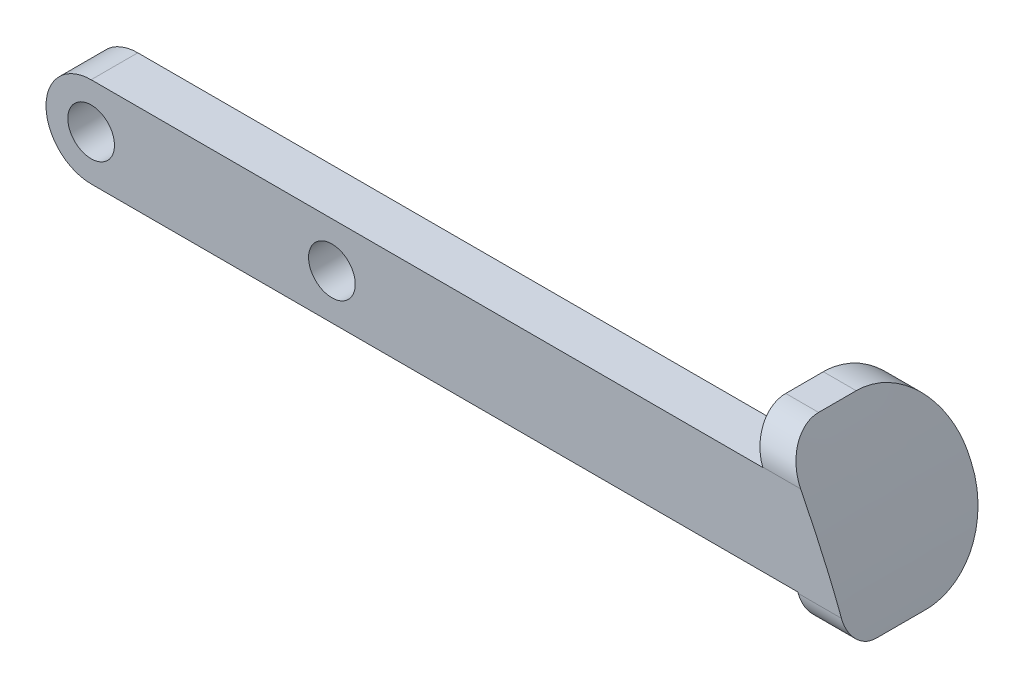
ISO-10303-21;
HEADER;
FILE_DESCRIPTION(('STEP AP214'),'2;1');
FILE_NAME('part.step','',(''),(''),'','','');
FILE_SCHEMA(('AUTOMOTIVE_DESIGN { 1 0 10303 214 1 1 1 1 }'));
ENDSEC;
DATA;
#1=APPLICATION_CONTEXT('core data for automotive mechanical design processes');
#2=APPLICATION_PROTOCOL_DEFINITION('international standard','automotive_design',2000,#1);
#3=PRODUCT_CONTEXT('',#1,'mechanical');
#4=PRODUCT('Part','Part','',(#3));
#5=PRODUCT_RELATED_PRODUCT_CATEGORY('part','',(#4));
#6=PRODUCT_DEFINITION_FORMATION('','',#4);
#7=PRODUCT_DEFINITION_CONTEXT('part definition',#1,'design');
#8=PRODUCT_DEFINITION('design','',#6,#7);
#9=PRODUCT_DEFINITION_SHAPE('','',#8);
#10=(LENGTH_UNIT() NAMED_UNIT(*) SI_UNIT(.MILLI.,.METRE.));
#11=(NAMED_UNIT(*) PLANE_ANGLE_UNIT() SI_UNIT($,.RADIAN.));
#12=(NAMED_UNIT(*) SI_UNIT($,.STERADIAN.) SOLID_ANGLE_UNIT());
#13=UNCERTAINTY_MEASURE_WITH_UNIT(LENGTH_MEASURE(1.E-05),#10,'distance_accuracy_value','');
#14=(GEOMETRIC_REPRESENTATION_CONTEXT(3) GLOBAL_UNCERTAINTY_ASSIGNED_CONTEXT((#13)) GLOBAL_UNIT_ASSIGNED_CONTEXT((#10,
#11,#12)) REPRESENTATION_CONTEXT('',''));
#15=CARTESIAN_POINT('',(0.,0.,0.));
#16=DIRECTION('',(0.,0.,1.));
#17=DIRECTION('',(1.,0.,0.));
#18=AXIS2_PLACEMENT_3D('',#15,#16,#17);
#19=CARTESIAN_POINT('',(0.,3.,-3.1));
#20=DIRECTION('',(0.,1.,0.));
#21=DIRECTION('',(0.,0.,-1.));
#22=AXIS2_PLACEMENT_3D('',#19,#20,#21);
#23=PLANE('',#22);
#24=DIRECTION('',(0.,0.,-1.));
#25=VECTOR('',#24,1.);
#26=CARTESIAN_POINT('',(44.6395584776889,3.,-3.1));
#27=LINE('',#26,#25);
#28=CARTESIAN_POINT('',(44.6395584776889,3.,0.));
#29=VERTEX_POINT('',#28);
#30=CARTESIAN_POINT('',(44.6395584776889,3.,-3.1));
#31=VERTEX_POINT('',#30);
#32=EDGE_CURVE('E153',#29,#31,#27,.T.);
#33=ORIENTED_EDGE('',*,*,#32,.T.);
#34=DIRECTION('',(1.,0.,0.));
#35=VECTOR('',#34,1.);
#36=CARTESIAN_POINT('',(0.,3.,-3.1));
#37=LINE('',#36,#35);
#38=CARTESIAN_POINT('',(0.,3.,-3.1));
#39=VERTEX_POINT('',#38);
#40=EDGE_CURVE('E252',#39,#31,#37,.T.);
#41=ORIENTED_EDGE('',*,*,#40,.F.);
#42=DIRECTION('',(0.,0.,1.));
#43=VECTOR('',#42,1.);
#44=CARTESIAN_POINT('',(0.,3.,-3.1));
#45=LINE('',#44,#43);
#46=CARTESIAN_POINT('',(0.,3.,0.));
#47=VERTEX_POINT('',#46);
#48=EDGE_CURVE('E172',#39,#47,#45,.T.);
#49=ORIENTED_EDGE('',*,*,#48,.T.);
#50=DIRECTION('',(1.,0.,0.));
#51=VECTOR('',#50,1.);
#52=CARTESIAN_POINT('',(0.,3.,0.));
#53=LINE('',#52,#51);
#54=EDGE_CURVE('E166',#47,#29,#53,.T.);
#55=ORIENTED_EDGE('',*,*,#54,.T.);
#56=EDGE_LOOP('',(#33,#41,#49,#55));
#57=FACE_BOUND('',#56,.T.);
#58=ADVANCED_FACE('F41',(#57),#23,.T.);
#59=CARTESIAN_POINT('',(0.,0.,-3.1));
#60=DIRECTION('',(0.,0.,1.));
#61=DIRECTION('',(-1.,0.,0.));
#62=AXIS2_PLACEMENT_3D('',#59,#60,#61);
#63=CYLINDRICAL_SURFACE('',#62,3.);
#64=CARTESIAN_POINT('',(0.,0.,0.));
#65=DIRECTION('',(0.,0.,1.));
#66=DIRECTION('',(1.,0.,0.));
#67=AXIS2_PLACEMENT_3D('',#64,#65,#66);
#68=CIRCLE('',#67,3.);
#69=CARTESIAN_POINT('',(0.,-3.,0.));
#70=VERTEX_POINT('',#69);
#71=EDGE_CURVE('E160',#47,#70,#68,.T.);
#72=ORIENTED_EDGE('',*,*,#71,.F.);
#73=ORIENTED_EDGE('',*,*,#48,.F.);
#74=CARTESIAN_POINT('',(0.,0.,-3.1));
#75=DIRECTION('',(0.,0.,1.));
#76=DIRECTION('',(1.,0.,0.));
#77=AXIS2_PLACEMENT_3D('',#74,#75,#76);
#78=CIRCLE('',#77,3.);
#79=CARTESIAN_POINT('',(0.,-3.,-3.1));
#80=VERTEX_POINT('',#79);
#81=EDGE_CURVE('E255',#39,#80,#78,.T.);
#82=ORIENTED_EDGE('',*,*,#81,.T.);
#83=DIRECTION('',(0.,0.,1.));
#84=VECTOR('',#83,1.);
#85=CARTESIAN_POINT('',(0.,-3.,-3.1));
#86=LINE('',#85,#84);
#87=EDGE_CURVE('E170',#80,#70,#86,.T.);
#88=ORIENTED_EDGE('',*,*,#87,.T.);
#89=EDGE_LOOP('',(#72,#73,#82,#88));
#90=FACE_BOUND('',#89,.T.);
#91=ADVANCED_FACE('F273',(#90),#63,.T.);
#92=CARTESIAN_POINT('',(0.,-3.,-3.1));
#93=DIRECTION('',(0.,1.,0.));
#94=DIRECTION('',(0.,0.,-1.));
#95=AXIS2_PLACEMENT_3D('',#92,#93,#94);
#96=PLANE('',#95);
#97=DIRECTION('',(1.,0.,0.));
#98=VECTOR('',#97,1.);
#99=CARTESIAN_POINT('',(0.,-3.,0.));
#100=LINE('',#99,#98);
#101=CARTESIAN_POINT('',(46.9652062875649,-3.,0.));
#102=VERTEX_POINT('',#101);
#103=EDGE_CURVE('E150',#70,#102,#100,.T.);
#104=ORIENTED_EDGE('',*,*,#103,.F.);
#105=ORIENTED_EDGE('',*,*,#87,.F.);
#106=DIRECTION('',(1.,0.,0.));
#107=VECTOR('',#106,1.);
#108=CARTESIAN_POINT('',(0.,-3.,-3.1));
#109=LINE('',#108,#107);
#110=CARTESIAN_POINT('',(46.9652062875649,-3.,-3.1));
#111=VERTEX_POINT('',#110);
#112=EDGE_CURVE('E152',#80,#111,#109,.T.);
#113=ORIENTED_EDGE('',*,*,#112,.T.);
#114=DIRECTION('',(0.,0.,-1.));
#115=VECTOR('',#114,1.);
#116=CARTESIAN_POINT('',(46.9652062875649,-3.,-3.1));
#117=LINE('',#116,#115);
#118=EDGE_CURVE('E136',#102,#111,#117,.T.);
#119=ORIENTED_EDGE('',*,*,#118,.F.);
#120=EDGE_LOOP('',(#104,#105,#113,#119));
#121=FACE_BOUND('',#120,.T.);
#122=ADVANCED_FACE('F148',(#121),#96,.F.);
#123=CARTESIAN_POINT('',(0.,0.,-3.1));
#124=DIRECTION('',(0.,0.,1.));
#125=DIRECTION('',(-1.,0.,0.));
#126=AXIS2_PLACEMENT_3D('',#123,#124,#125);
#127=CYLINDRICAL_SURFACE('',#126,1.55);
#128=CARTESIAN_POINT('',(0.,0.,-3.1));
#129=DIRECTION('',(0.,0.,1.));
#130=DIRECTION('',(1.,0.,0.));
#131=AXIS2_PLACEMENT_3D('',#128,#129,#130);
#132=CIRCLE('',#131,1.55);
#133=CARTESIAN_POINT('',(-1.55,0.,-3.1));
#134=VERTEX_POINT('',#133);
#135=EDGE_CURVE('E164',#134,#134,#132,.T.);
#136=CARTESIAN_POINT('',(0.,0.,0.));
#137=DIRECTION('',(0.,0.,1.));
#138=DIRECTION('',(1.,0.,0.));
#139=AXIS2_PLACEMENT_3D('',#136,#137,#138);
#140=CIRCLE('',#139,1.55);
#141=CARTESIAN_POINT('',(-1.55,0.,0.));
#142=VERTEX_POINT('',#141);
#143=EDGE_CURVE('E261',#142,#142,#140,.T.);
#144=CARTESIAN_POINT('',(-1.55,0.,-3.1));
#145=CARTESIAN_POINT('',(-1.55,0.,-3.06770833333333));
#146=CARTESIAN_POINT('',(-1.55,0.,-3.03541666666667));
#147=CARTESIAN_POINT('',(-1.55,0.,-2.97083333333333));
#148=CARTESIAN_POINT('',(-1.55,0.,-2.93854166666667));
#149=CARTESIAN_POINT('',(-1.55,0.,-2.87395833333333));
#150=CARTESIAN_POINT('',(-1.55,0.,-2.84166666666667));
#151=CARTESIAN_POINT('',(-1.55,0.,-2.77708333333333));
#152=CARTESIAN_POINT('',(-1.55,0.,-2.74479166666667));
#153=CARTESIAN_POINT('',(-1.55,0.,-2.68020833333333));
#154=CARTESIAN_POINT('',(-1.55,0.,-2.64791666666667));
#155=CARTESIAN_POINT('',(-1.55,0.,-2.58333333333333));
#156=CARTESIAN_POINT('',(-1.55,0.,-2.55104166666667));
#157=CARTESIAN_POINT('',(-1.55,0.,-2.48645833333333));
#158=CARTESIAN_POINT('',(-1.55,0.,-2.45416666666667));
#159=CARTESIAN_POINT('',(-1.55,0.,-2.38958333333333));
#160=CARTESIAN_POINT('',(-1.55,0.,-2.35729166666667));
#161=CARTESIAN_POINT('',(-1.55,0.,-2.29270833333333));
#162=CARTESIAN_POINT('',(-1.55,0.,-2.26041666666667));
#163=CARTESIAN_POINT('',(-1.55,0.,-2.19583333333333));
#164=CARTESIAN_POINT('',(-1.55,0.,-2.16354166666667));
#165=CARTESIAN_POINT('',(-1.55,0.,-2.09895833333333));
#166=CARTESIAN_POINT('',(-1.55,0.,-2.06666666666667));
#167=CARTESIAN_POINT('',(-1.55,0.,-2.00208333333333));
#168=CARTESIAN_POINT('',(-1.55,0.,-1.96979166666667));
#169=CARTESIAN_POINT('',(-1.55,0.,-1.90520833333333));
#170=CARTESIAN_POINT('',(-1.55,0.,-1.87291666666667));
#171=CARTESIAN_POINT('',(-1.55,0.,-1.80833333333333));
#172=CARTESIAN_POINT('',(-1.55,0.,-1.77604166666667));
#173=CARTESIAN_POINT('',(-1.55,0.,-1.71145833333333));
#174=CARTESIAN_POINT('',(-1.55,0.,-1.67916666666667));
#175=CARTESIAN_POINT('',(-1.55,0.,-1.61458333333333));
#176=CARTESIAN_POINT('',(-1.55,0.,-1.58229166666667));
#177=CARTESIAN_POINT('',(-1.55,0.,-1.51770833333333));
#178=CARTESIAN_POINT('',(-1.55,0.,-1.48541666666667));
#179=CARTESIAN_POINT('',(-1.55,0.,-1.42083333333333));
#180=CARTESIAN_POINT('',(-1.55,0.,-1.38854166666667));
#181=CARTESIAN_POINT('',(-1.55,0.,-1.32395833333333));
#182=CARTESIAN_POINT('',(-1.55,0.,-1.29166666666667));
#183=CARTESIAN_POINT('',(-1.55,0.,-1.22708333333333));
#184=CARTESIAN_POINT('',(-1.55,0.,-1.19479166666667));
#185=CARTESIAN_POINT('',(-1.55,0.,-1.13020833333333));
#186=CARTESIAN_POINT('',(-1.55,0.,-1.09791666666667));
#187=CARTESIAN_POINT('',(-1.55,0.,-1.03333333333333));
#188=CARTESIAN_POINT('',(-1.55,0.,-1.00104166666667));
#189=CARTESIAN_POINT('',(-1.55,0.,-0.936458333333334));
#190=CARTESIAN_POINT('',(-1.55,0.,-0.904166666666667));
#191=CARTESIAN_POINT('',(-1.55,0.,-0.839583333333334));
#192=CARTESIAN_POINT('',(-1.55,0.,-0.807291666666667));
#193=CARTESIAN_POINT('',(-1.55,0.,-0.742708333333334));
#194=CARTESIAN_POINT('',(-1.55,0.,-0.710416666666667));
#195=CARTESIAN_POINT('',(-1.55,0.,-0.645833333333334));
#196=CARTESIAN_POINT('',(-1.55,0.,-0.613541666666667));
#197=CARTESIAN_POINT('',(-1.55,0.,-0.548958333333333));
#198=CARTESIAN_POINT('',(-1.55,0.,-0.516666666666667));
#199=CARTESIAN_POINT('',(-1.55,0.,-0.452083333333333));
#200=CARTESIAN_POINT('',(-1.55,0.,-0.419791666666667));
#201=CARTESIAN_POINT('',(-1.55,0.,-0.355208333333334));
#202=CARTESIAN_POINT('',(-1.55,0.,-0.322916666666667));
#203=CARTESIAN_POINT('',(-1.55,0.,-0.258333333333333));
#204=CARTESIAN_POINT('',(-1.55,0.,-0.226041666666667));
#205=CARTESIAN_POINT('',(-1.55,0.,-0.161458333333333));
#206=CARTESIAN_POINT('',(-1.55,0.,-0.129166666666667));
#207=CARTESIAN_POINT('',(-1.55,0.,-0.0645833333333335));
#208=CARTESIAN_POINT('',(-1.55,0.,-0.0322916666666667));
#209=CARTESIAN_POINT('',(-1.55,0.,0.));
#210=B_SPLINE_CURVE_WITH_KNOTS('',3,(#144,#145,#146,#147,#148,#149,#150,#151,#152,#153,#154,
#155,#156,#157,#158,#159,#160,#161,#162,#163,#164,#165,#166,#167,#168,#169,#170,#171,#172,#173,
#174,#175,#176,#177,#178,#179,#180,#181,#182,#183,#184,#185,#186,#187,#188,#189,#190,#191,#192,
#193,#194,#195,#196,#197,#198,#199,#200,#201,#202,#203,#204,#205,#206,#207,#208,#209),
.UNSPECIFIED.,.F.,.F.,(4,2,2,2,2,2,2,2,2,2,2,2,2,2,2,2,2,2,2,2,2,2,2,2,2,2,2,2,2,2,2,2,4),(0.,
0.0968750000000002,0.19375,0.290625,0.3875,0.484375,0.58125,0.678125,0.775,0.871875,0.96875,
1.065625,1.1625,1.259375,1.35625,1.453125,1.55,1.646875,1.74375,1.840625,1.9375,2.034375,
2.13125,2.228125,2.325,2.421875,2.51875,2.615625,2.7125,2.809375,2.90625,3.003125,3.1),.UNSPECIFIED.);
#211=EDGE_CURVE('BSEAM280',#134,#142,#210,.T.);
#212=ORIENTED_EDGE('',*,*,#135,.F.);
#213=ORIENTED_EDGE('',*,*,#143,.T.);
#214=ORIENTED_EDGE('',*,*,#211,.T.);
#215=ORIENTED_EDGE('',*,*,#211,.F.);
#216=EDGE_LOOP('',(#212,#214,#213,#215));
#217=FACE_BOUND('',#216,.T.);
#218=ADVANCED_FACE('F280',(#217),#127,.F.);
#219=CARTESIAN_POINT('',(16.,0.,-3.1));
#220=DIRECTION('',(0.,0.,1.));
#221=DIRECTION('',(-1.,0.,0.));
#222=AXIS2_PLACEMENT_3D('',#219,#220,#221);
#223=CYLINDRICAL_SURFACE('',#222,1.55);
#224=CARTESIAN_POINT('',(16.,0.,-3.1));
#225=DIRECTION('',(0.,0.,1.));
#226=DIRECTION('',(1.,0.,0.));
#227=AXIS2_PLACEMENT_3D('',#224,#225,#226);
#228=CIRCLE('',#227,1.55);
#229=CARTESIAN_POINT('',(14.45,0.,-3.1));
#230=VERTEX_POINT('',#229);
#231=EDGE_CURVE('E161',#230,#230,#228,.T.);
#232=CARTESIAN_POINT('',(16.,0.,0.));
#233=DIRECTION('',(0.,0.,1.));
#234=DIRECTION('',(1.,0.,0.));
#235=AXIS2_PLACEMENT_3D('',#232,#233,#234);
#236=CIRCLE('',#235,1.55);
#237=CARTESIAN_POINT('',(14.45,0.,0.));
#238=VERTEX_POINT('',#237);
#239=EDGE_CURVE('E248',#238,#238,#236,.T.);
#240=CARTESIAN_POINT('',(14.45,0.,-3.1));
#241=CARTESIAN_POINT('',(14.45,0.,-3.06770833333333));
#242=CARTESIAN_POINT('',(14.45,0.,-3.03541666666667));
#243=CARTESIAN_POINT('',(14.45,0.,-2.97083333333333));
#244=CARTESIAN_POINT('',(14.45,0.,-2.93854166666667));
#245=CARTESIAN_POINT('',(14.45,0.,-2.87395833333333));
#246=CARTESIAN_POINT('',(14.45,0.,-2.84166666666667));
#247=CARTESIAN_POINT('',(14.45,0.,-2.77708333333333));
#248=CARTESIAN_POINT('',(14.45,0.,-2.74479166666667));
#249=CARTESIAN_POINT('',(14.45,0.,-2.68020833333333));
#250=CARTESIAN_POINT('',(14.45,0.,-2.64791666666667));
#251=CARTESIAN_POINT('',(14.45,0.,-2.58333333333333));
#252=CARTESIAN_POINT('',(14.45,0.,-2.55104166666667));
#253=CARTESIAN_POINT('',(14.45,0.,-2.48645833333333));
#254=CARTESIAN_POINT('',(14.45,0.,-2.45416666666667));
#255=CARTESIAN_POINT('',(14.45,0.,-2.38958333333333));
#256=CARTESIAN_POINT('',(14.45,0.,-2.35729166666667));
#257=CARTESIAN_POINT('',(14.45,0.,-2.29270833333333));
#258=CARTESIAN_POINT('',(14.45,0.,-2.26041666666667));
#259=CARTESIAN_POINT('',(14.45,0.,-2.19583333333333));
#260=CARTESIAN_POINT('',(14.45,0.,-2.16354166666667));
#261=CARTESIAN_POINT('',(14.45,0.,-2.09895833333333));
#262=CARTESIAN_POINT('',(14.45,0.,-2.06666666666667));
#263=CARTESIAN_POINT('',(14.45,0.,-2.00208333333333));
#264=CARTESIAN_POINT('',(14.45,0.,-1.96979166666667));
#265=CARTESIAN_POINT('',(14.45,0.,-1.90520833333333));
#266=CARTESIAN_POINT('',(14.45,0.,-1.87291666666667));
#267=CARTESIAN_POINT('',(14.45,0.,-1.80833333333333));
#268=CARTESIAN_POINT('',(14.45,0.,-1.77604166666667));
#269=CARTESIAN_POINT('',(14.45,0.,-1.71145833333333));
#270=CARTESIAN_POINT('',(14.45,0.,-1.67916666666667));
#271=CARTESIAN_POINT('',(14.45,0.,-1.61458333333333));
#272=CARTESIAN_POINT('',(14.45,0.,-1.58229166666667));
#273=CARTESIAN_POINT('',(14.45,0.,-1.51770833333333));
#274=CARTESIAN_POINT('',(14.45,0.,-1.48541666666667));
#275=CARTESIAN_POINT('',(14.45,0.,-1.42083333333333));
#276=CARTESIAN_POINT('',(14.45,0.,-1.38854166666667));
#277=CARTESIAN_POINT('',(14.45,0.,-1.32395833333333));
#278=CARTESIAN_POINT('',(14.45,0.,-1.29166666666667));
#279=CARTESIAN_POINT('',(14.45,0.,-1.22708333333333));
#280=CARTESIAN_POINT('',(14.45,0.,-1.19479166666667));
#281=CARTESIAN_POINT('',(14.45,0.,-1.13020833333333));
#282=CARTESIAN_POINT('',(14.45,0.,-1.09791666666667));
#283=CARTESIAN_POINT('',(14.45,0.,-1.03333333333333));
#284=CARTESIAN_POINT('',(14.45,0.,-1.00104166666667));
#285=CARTESIAN_POINT('',(14.45,0.,-0.936458333333334));
#286=CARTESIAN_POINT('',(14.45,0.,-0.904166666666667));
#287=CARTESIAN_POINT('',(14.45,0.,-0.839583333333334));
#288=CARTESIAN_POINT('',(14.45,0.,-0.807291666666667));
#289=CARTESIAN_POINT('',(14.45,0.,-0.742708333333334));
#290=CARTESIAN_POINT('',(14.45,0.,-0.710416666666667));
#291=CARTESIAN_POINT('',(14.45,0.,-0.645833333333334));
#292=CARTESIAN_POINT('',(14.45,0.,-0.613541666666667));
#293=CARTESIAN_POINT('',(14.45,0.,-0.548958333333333));
#294=CARTESIAN_POINT('',(14.45,0.,-0.516666666666667));
#295=CARTESIAN_POINT('',(14.45,0.,-0.452083333333333));
#296=CARTESIAN_POINT('',(14.45,0.,-0.419791666666667));
#297=CARTESIAN_POINT('',(14.45,0.,-0.355208333333334));
#298=CARTESIAN_POINT('',(14.45,0.,-0.322916666666667));
#299=CARTESIAN_POINT('',(14.45,0.,-0.258333333333333));
#300=CARTESIAN_POINT('',(14.45,0.,-0.226041666666667));
#301=CARTESIAN_POINT('',(14.45,0.,-0.161458333333333));
#302=CARTESIAN_POINT('',(14.45,0.,-0.129166666666667));
#303=CARTESIAN_POINT('',(14.45,0.,-0.0645833333333335));
#304=CARTESIAN_POINT('',(14.45,0.,-0.0322916666666667));
#305=CARTESIAN_POINT('',(14.45,0.,0.));
#306=B_SPLINE_CURVE_WITH_KNOTS('',3,(#240,#241,#242,#243,#244,#245,#246,#247,#248,#249,#250,
#251,#252,#253,#254,#255,#256,#257,#258,#259,#260,#261,#262,#263,#264,#265,#266,#267,#268,#269,
#270,#271,#272,#273,#274,#275,#276,#277,#278,#279,#280,#281,#282,#283,#284,#285,#286,#287,#288,
#289,#290,#291,#292,#293,#294,#295,#296,#297,#298,#299,#300,#301,#302,#303,#304,#305),
.UNSPECIFIED.,.F.,.F.,(4,2,2,2,2,2,2,2,2,2,2,2,2,2,2,2,2,2,2,2,2,2,2,2,2,2,2,2,2,2,2,2,4),(0.,
0.0968750000000002,0.19375,0.290625,0.3875,0.484375,0.58125,0.678125,0.775,0.871875,0.96875,
1.065625,1.1625,1.259375,1.35625,1.453125,1.55,1.646875,1.74375,1.840625,1.9375,2.034375,
2.13125,2.228125,2.325,2.421875,2.51875,2.615625,2.7125,2.809375,2.90625,3.003125,3.1),.UNSPECIFIED.);
#307=EDGE_CURVE('BSEAM286',#230,#238,#306,.T.);
#308=ORIENTED_EDGE('',*,*,#231,.F.);
#309=ORIENTED_EDGE('',*,*,#239,.T.);
#310=ORIENTED_EDGE('',*,*,#307,.T.);
#311=ORIENTED_EDGE('',*,*,#307,.F.);
#312=EDGE_LOOP('',(#308,#310,#309,#311));
#313=FACE_BOUND('',#312,.T.);
#314=ADVANCED_FACE('F286',(#313),#223,.F.);
#315=CARTESIAN_POINT('',(0.,0.,-3.1));
#316=DIRECTION('',(0.,0.,-1.));
#317=DIRECTION('',(1.,0.,0.));
#318=AXIS2_PLACEMENT_3D('',#315,#316,#317);
#319=PLANE('',#318);
#320=DIRECTION('',(0.361408593812913,-0.932407544112645,0.));
#321=VECTOR('',#320,1.);
#322=CARTESIAN_POINT('',(39.819850541901,15.4344913670606,-3.1));
#323=LINE('',#322,#321);
#324=EDGE_CURVE('E154',#31,#111,#323,.T.);
#325=ORIENTED_EDGE('',*,*,#324,.T.);
#326=ORIENTED_EDGE('',*,*,#112,.F.);
#327=ORIENTED_EDGE('',*,*,#81,.F.);
#328=ORIENTED_EDGE('',*,*,#40,.T.);
#329=EDGE_LOOP('',(#325,#326,#327,#328));
#330=FACE_BOUND('',#329,.T.);
#331=ORIENTED_EDGE('',*,*,#231,.T.);
#332=EDGE_LOOP('',(#331));
#333=FACE_BOUND('',#332,.T.);
#334=ORIENTED_EDGE('',*,*,#135,.T.);
#335=EDGE_LOOP('',(#334));
#336=FACE_BOUND('',#335,.T.);
#337=ADVANCED_FACE('F213',(#330,#333,#336),#319,.T.);
#338=CARTESIAN_POINT('',(0.,0.,0.));
#339=DIRECTION('',(0.,0.,-1.));
#340=DIRECTION('',(1.,0.,0.));
#341=AXIS2_PLACEMENT_3D('',#338,#339,#340);
#342=PLANE('',#341);
#343=ORIENTED_EDGE('',*,*,#239,.F.);
#344=EDGE_LOOP('',(#343));
#345=FACE_BOUND('',#344,.T.);
#346=ORIENTED_EDGE('',*,*,#143,.F.);
#347=EDGE_LOOP('',(#346));
#348=FACE_BOUND('',#347,.T.);
#349=CARTESIAN_POINT('',(45.8446255617211,5.52517801406493,0.));
#350=CARTESIAN_POINT('',(47.6225170615618,2.2123782727855,0.));
#351=CARTESIAN_POINT('',(49.2890510500116,-1.18916518240475,0.));
#352=CARTESIAN_POINT('',(50.4632290338258,-4.76886794904122,0.));
#353=B_SPLINE_CURVE_WITH_KNOTS('',3,(#349,#350,#351,#352),.UNSPECIFIED.,.F.,.F.,(4,4),(0.,1.),.UNSPECIFIED.);
#354=CARTESIAN_POINT('',(47.1498799686748,3.02517801406503,0.));
#355=VERTEX_POINT('',#354);
#356=CARTESIAN_POINT('',(49.8652239145846,-3.06886794904115,0.));
#357=VERTEX_POINT('',#356);
#358=EDGE_CURVE('E229',#355,#357,#353,.T.);
#359=ORIENTED_EDGE('',*,*,#358,.F.);
#360=DIRECTION('',(1.,0.,0.));
#361=VECTOR('',#360,1.);
#362=CARTESIAN_POINT('',(45.8446255617211,3.02517801406493,0.));
#363=LINE('',#362,#361);
#364=CARTESIAN_POINT('',(44.629799278811,3.02517801406493,0.));
#365=VERTEX_POINT('',#364);
#366=EDGE_CURVE('E316',#365,#355,#363,.T.);
#367=ORIENTED_EDGE('',*,*,#366,.F.);
#368=DIRECTION('',(-0.361408593812913,0.932407544112644,0.));
#369=VECTOR('',#368,1.);
#370=CARTESIAN_POINT('',(43.6607793580293,5.52517801406493,0.));
#371=LINE('',#370,#369);
#372=EDGE_CURVE('E145',#29,#365,#371,.T.);
#373=ORIENTED_EDGE('',*,*,#372,.F.);
#374=ORIENTED_EDGE('',*,*,#54,.F.);
#375=ORIENTED_EDGE('',*,*,#71,.T.);
#376=ORIENTED_EDGE('',*,*,#103,.T.);
#377=CARTESIAN_POINT('',(46.9919000533746,-3.06886794904122,0.));
#378=VERTEX_POINT('',#377);
#379=EDGE_CURVE('E133',#378,#102,#371,.T.);
#380=ORIENTED_EDGE('',*,*,#379,.F.);
#381=DIRECTION('',(-1.,0.,0.));
#382=VECTOR('',#381,1.);
#383=CARTESIAN_POINT('',(47.6508335995062,-3.06886794904122,0.));
#384=LINE('',#383,#382);
#385=EDGE_CURVE('E339',#357,#378,#384,.T.);
#386=ORIENTED_EDGE('',*,*,#385,.F.);
#387=EDGE_LOOP('',(#359,#367,#373,#374,#375,#376,#380,#386));
#388=FACE_BOUND('',#387,.T.);
#389=ADVANCED_FACE('F158',(#345,#348,#388),#342,.F.);
#390=CARTESIAN_POINT('',(45.8446255617211,5.52517801406493,-10.));
#391=CARTESIAN_POINT('',(47.6225170615618,2.2123782727855,-10.));
#392=CARTESIAN_POINT('',(49.2890510500116,-1.18916518240475,-10.));
#393=CARTESIAN_POINT('',(50.4632290338258,-4.76886794904122,-10.));
#394=B_SPLINE_CURVE_WITH_KNOTS('',3,(#390,#391,#392,#393),.UNSPECIFIED.,.F.,.F.,(4,4),(0.,1.),.UNSPECIFIED.);
#395=DIRECTION('',(0.,0.,1.));
#396=VECTOR('',#395,1.);
#397=SURFACE_OF_LINEAR_EXTRUSION('',#394,#396);
#398=DIRECTION('',(0.,0.,1.));
#399=VECTOR('',#398,1.);
#400=CARTESIAN_POINT('',(50.4632290338258,-4.76886794904122,-10.));
#401=LINE('',#400,#399);
#402=CARTESIAN_POINT('',(50.4632290338258,-4.76886794904122,-5.));
#403=VERTEX_POINT('',#402);
#404=CARTESIAN_POINT('',(50.4632290338258,-4.76886794904122,-1.7));
#405=VERTEX_POINT('',#404);
#406=EDGE_CURVE('E228',#403,#405,#401,.T.);
#407=ORIENTED_EDGE('',*,*,#406,.F.);
#408=CARTESIAN_POINT('',(48.4930884409791,0.231132050958781,-10.));
#409=CARTESIAN_POINT('',(48.5596761804852,0.0844007288168149,-10.0000069779001));
#410=CARTESIAN_POINT('',(48.6256932600272,-0.0626064181320284,-9.99354081425444));
#411=CARTESIAN_POINT('',(48.7561396735039,-0.356225784137563,-9.96756702051866));
#412=CARTESIAN_POINT('',(48.820568498141,-0.502837863424689,-9.94805526214704));
#413=CARTESIAN_POINT('',(48.9475354432491,-0.795054942855532,-9.89581835870529));
#414=CARTESIAN_POINT('',(49.0100674533572,-0.940655719216084,-9.86305456496875));
#415=CARTESIAN_POINT('',(49.1325863612974,-1.22931638755786,-9.78429390715526));
#416=CARTESIAN_POINT('',(49.1925735152128,-1.37237653435072,-9.73829837820026));
#417=CARTESIAN_POINT('',(49.3097281259377,-1.6551832642757,-9.63299445044576));
#418=CARTESIAN_POINT('',(49.3668881205666,-1.79492062026427,-9.57365289754996));
#419=CARTESIAN_POINT('',(49.4778198533986,-2.06948666861618,-9.44188450609099));
#420=CARTESIAN_POINT('',(49.5315917504777,-2.20431559102236,-9.36945828171625));
#421=CARTESIAN_POINT('',(49.6353074075545,-2.46762165232322,-9.21191553567224));
#422=CARTESIAN_POINT('',(49.6852563844632,-2.59610735919521,-9.12681679237507));
#423=CARTESIAN_POINT('',(49.7810767542162,-2.84562712160713,-8.94429222287648));
#424=CARTESIAN_POINT('',(49.826948484538,-2.96666179362051,-8.8468674185349));
#425=CARTESIAN_POINT('',(49.9115017678737,-3.19242660988634,-8.64698288652698));
#426=CARTESIAN_POINT('',(49.9504565561542,-3.29770502253179,-8.54525750804966));
#427=CARTESIAN_POINT('',(50.0243581057138,-3.49956503500845,-8.33218124401082));
#428=CARTESIAN_POINT('',(50.0593051901517,-3.59614733591012,-8.22083113580502));
#429=CARTESIAN_POINT('',(50.1250446307716,-3.77964147065492,-7.98923541822149));
#430=CARTESIAN_POINT('',(50.155835960489,-3.86655091439185,-7.86898762244331));
#431=CARTESIAN_POINT('',(50.2131312801512,-4.02973141755922,-7.62052069010088));
#432=CARTESIAN_POINT('',(50.2396356151681,-4.10600333316536,-7.49230219627126));
#433=CARTESIAN_POINT('',(50.2865779439868,-4.24215847553799,-7.23807862685347));
#434=CARTESIAN_POINT('',(50.3073096661881,-4.30281264440841,-7.11253996606943));
#435=CARTESIAN_POINT('',(50.3449378085286,-4.41358908006881,-6.85635076659207));
#436=CARTESIAN_POINT('',(50.3618345229326,-4.46371215490066,-6.72570062101177));
#437=CARTESIAN_POINT('',(50.3917441291674,-4.55287836161986,-6.46041223772643));
#438=CARTESIAN_POINT('',(50.4047615261213,-4.59193434331516,-6.32577882726947));
#439=CARTESIAN_POINT('',(50.4269152904088,-4.65864043815421,-6.05345651786395));
#440=CARTESIAN_POINT('',(50.4360532321717,-4.68629517822037,-5.91576888235336));
#441=CARTESIAN_POINT('',(50.4499127692377,-4.728323814497,-5.64861254571213));
#442=CARTESIAN_POINT('',(50.4549107379208,-4.74352786562429,-5.51928804884119));
#443=CARTESIAN_POINT('',(50.4615662687789,-4.76379907331095,-5.25997724148349));
#444=CARTESIAN_POINT('',(50.4632293339671,-4.76888292937344,-5.12999237669643));
#445=CARTESIAN_POINT('',(50.4632290338258,-4.76886794904122,-5.));
#446=B_SPLINE_CURVE_WITH_KNOTS('',3,(#408,#409,#410,#411,#412,#413,#414,#415,#416,#417,#418,
#419,#420,#421,#422,#423,#424,#425,#426,#427,#428,#429,#430,#431,#432,#433,#434,#435,#436,#437,
#438,#439,#440,#441,#442,#443,#444,#445),.UNSPECIFIED.,.F.,.F.,(4,2,2,2,2,2,2,2,2,2,2,2,2,2,2,2,
2,2,4),(0.,0.48329299092671,0.96673899246441,1.45160521658183,1.93642253338684,2.42245780044711,
2.90847025916163,3.39380720111833,3.87910393381828,4.33298104852331,4.78682153935593,
5.24077392370179,5.69468974997018,6.11703168544179,6.5393412031331,6.96115835647857,
7.38280415646802,7.77330276440966,8.16315646815633),.UNSPECIFIED.);
#447=CARTESIAN_POINT('',(48.4930884409794,0.231132050959114,-10.));
#448=VERTEX_POINT('',#447);
#449=EDGE_CURVE('E194',#448,#403,#446,.T.);
#450=ORIENTED_EDGE('',*,*,#449,.F.);
#451=CARTESIAN_POINT('',(48.3587581904946,0.525178014065088,-10.));
#452=VERTEX_POINT('',#451);
#453=EDGE_CURVE('E144',#452,#448,#394,.T.);
#454=ORIENTED_EDGE('',*,*,#453,.F.);
#455=CARTESIAN_POINT('',(45.8446255617211,5.52517801406493,-5.));
#456=CARTESIAN_POINT('',(45.844612055669,5.52520032541012,-5.12894689257132));
#457=CARTESIAN_POINT('',(45.8473020135973,5.52019080682159,-5.25788474204632));
#458=CARTESIAN_POINT('',(45.8579889588883,5.50027365409044,-5.51473280770917));
#459=CARTESIAN_POINT('',(45.8659842744154,5.48536913807972,-5.64264333478168));
#460=CARTESIAN_POINT('',(45.8871396337001,5.44590665570231,-5.89600045705318));
#461=CARTESIAN_POINT('',(45.9002788301121,5.42138765470114,-6.02145487806531));
#462=CARTESIAN_POINT('',(45.9315377979842,5.36299985537038,-6.26953423333331));
#463=CARTESIAN_POINT('',(45.9496577714741,5.32913067777954,-6.3921590525964));
#464=CARTESIAN_POINT('',(45.9906216030089,5.25246849655112,-6.63363078077556));
#465=CARTESIAN_POINT('',(46.0134604433272,5.20968497142849,-6.75248154914413));
#466=CARTESIAN_POINT('',(46.0635873879391,5.1156399591089,-6.98582714292488));
#467=CARTESIAN_POINT('',(46.0908771618346,5.06437529042319,-7.10032031379271));
#468=CARTESIAN_POINT('',(46.1789787559354,4.89857350179391,-7.43632741453544));
#469=CARTESIAN_POINT('',(46.246033471092,4.77200879609154,-7.65043046965443));
#470=CARTESIAN_POINT('',(46.3975372056785,4.48456421811713,-8.06430140035973));
#471=CARTESIAN_POINT('',(46.482681503546,4.32229877430508,-8.26283982377646));
#472=CARTESIAN_POINT('',(46.6648146416682,3.97276468436136,-8.630215686075));
#473=CARTESIAN_POINT('',(46.7618073262775,3.78548792115139,-8.79904344136953));
#474=CARTESIAN_POINT('',(46.9760163522791,3.36830511332541,-9.12237458298746));
#475=CARTESIAN_POINT('',(47.0942778141278,3.13597317527722,-9.27305484517216));
#476=CARTESIAN_POINT('',(47.337506572345,2.65247231201106,-9.53322180226189));
#477=CARTESIAN_POINT('',(47.4624779514197,2.40129188045373,-9.64268308501774));
#478=CARTESIAN_POINT('',(47.7166820015217,1.88315234438987,-9.81991060189795));
#479=CARTESIAN_POINT('',(47.8459447250183,1.61606095702039,-9.88725051223936));
#480=CARTESIAN_POINT('',(48.0392534191688,1.21004541459007,-9.95477592650196));
#481=CARTESIAN_POINT('',(48.1035776897444,1.07384171555597,-9.97170361097202));
#482=CARTESIAN_POINT('',(48.2316741035906,0.800245289498363,-9.99431200598105));
#483=CARTESIAN_POINT('',(48.295446240788,0.662852549429205,-9.99999259296406));
#484=CARTESIAN_POINT('',(48.3587581904946,0.525178014065096,-10.));
#485=B_SPLINE_CURVE_WITH_KNOTS('',3,(#455,#456,#457,#458,#459,#460,#461,#462,#463,#464,#465,
#466,#467,#468,#469,#470,#471,#472,#473,#474,#475,#476,#477,#478,#479,#480,#481,#482,#483,#484),
.UNSPECIFIED.,.F.,.F.,(4,2,2,2,2,2,2,2,2,2,2,2,2,2,4),(0.,0.386701247288153,0.773280694289821,
1.15830934999344,1.5433536254987,1.9279905586154,2.31277210718464,3.08214097274196,
3.88949076485224,4.69710321079233,5.59672322437804,6.49689696331696,7.40604017413921,
7.86040752386931,8.31477986506312),.UNSPECIFIED.);
#486=CARTESIAN_POINT('',(45.8446255617211,5.52517801406493,-5.));
#487=VERTEX_POINT('',#486);
#488=EDGE_CURVE('E186',#487,#452,#485,.T.);
#489=ORIENTED_EDGE('',*,*,#488,.F.);
#490=DIRECTION('',(0.,0.,1.));
#491=VECTOR('',#490,1.);
#492=CARTESIAN_POINT('',(45.8446255617211,5.52517801406493,-10.));
#493=LINE('',#492,#491);
#494=CARTESIAN_POINT('',(45.8446255617211,5.52517801406493,-2.5));
#495=VERTEX_POINT('',#494);
#496=EDGE_CURVE('E237',#487,#495,#493,.T.);
#497=ORIENTED_EDGE('',*,*,#496,.T.);
#498=CARTESIAN_POINT('',(47.1498799686747,3.02517801406493,0.));
#499=CARTESIAN_POINT('',(47.0714822798714,3.18042498483698,2.74764117618217E-05));
#500=CARTESIAN_POINT('',(46.9925885682587,3.33547452504738,-0.0144630732755245));
#501=CARTESIAN_POINT('',(46.8359585984083,3.64135389254784,-0.0721217237579438));
#502=CARTESIAN_POINT('',(46.7582265972328,3.79216942968226,-0.115377032752658));
#503=CARTESIAN_POINT('',(46.6064693375411,4.08496414661408,-0.230282645962123));
#504=CARTESIAN_POINT('',(46.5324494607051,4.22693056581575,-0.301972905689635));
#505=CARTESIAN_POINT('',(46.391062423182,4.49685612196524,-0.472773429717924));
#506=CARTESIAN_POINT('',(46.3236878560492,4.62483087081766,-0.571852688500329));
#507=CARTESIAN_POINT('',(46.2023325112556,4.85450780075351,-0.789166274447955));
#508=CARTESIAN_POINT('',(46.1477883781618,4.95733030953245,-0.905881208157153));
#509=CARTESIAN_POINT('',(46.0745011360641,5.09514045902349,-1.09593020796981));
#510=CARTESIAN_POINT('',(46.0514854780529,5.13835497104457,-1.16180756792905));
#511=CARTESIAN_POINT('',(46.0086181907068,5.21875447845802,-1.29813830421373));
#512=CARTESIAN_POINT('',(45.9887659478706,5.25594064299076,-1.36859078951629));
#513=CARTESIAN_POINT('',(45.9547670875005,5.31956934014822,-1.50465703754549));
#514=CARTESIAN_POINT('',(45.940220317233,5.3467682397269,-1.56981890413932));
#515=CARTESIAN_POINT('',(45.9140351720694,5.39569804230047,-1.70272592528889));
#516=CARTESIAN_POINT('',(45.9023962947022,5.4174298899825,-1.77047063120626));
#517=CARTESIAN_POINT('',(45.8822237618985,5.45507891169791,-1.90784761764563));
#518=CARTESIAN_POINT('',(45.8736834922397,5.47100847146055,-1.97747553258287));
#519=CARTESIAN_POINT('',(45.859813656103,5.49687187230107,-2.1181160357354));
#520=CARTESIAN_POINT('',(45.8544819416248,5.50680972459732,-2.18912766465744));
#521=CARTESIAN_POINT('',(45.8487408032335,5.51750955022813,-2.30029130010409));
#522=CARTESIAN_POINT('',(45.8471972543524,5.52038594596278,-2.34019504560636));
#523=CARTESIAN_POINT('',(45.8451401385236,5.52421919309211,-2.42006380239128));
#524=CARTESIAN_POINT('',(45.8446251013843,5.52517878443622,-2.46002864438367));
#525=CARTESIAN_POINT('',(45.8446255617211,5.52517801406493,-2.5));
#526=B_SPLINE_CURVE_WITH_KNOTS('',3,(#498,#499,#500,#501,#502,#503,#504,#505,#506,#507,#508,
#509,#510,#511,#512,#513,#514,#515,#516,#517,#518,#519,#520,#521,#522,#523,#524,#525),
.UNSPECIFIED.,.F.,.F.,(4,2,2,2,2,2,2,2,2,2,2,2,2,4),(0.,0.521245705702186,1.0440789585235,
1.56764949065575,2.09062972877987,2.58200565737025,2.82790545956814,3.07375751464917,
3.28974327544293,3.50569168898992,3.72117639334369,3.93651667830635,4.05657479071794,
4.17646116456472),.UNSPECIFIED.);
#527=EDGE_CURVE('E322',#355,#495,#526,.T.);
#528=ORIENTED_EDGE('',*,*,#527,.F.);
#529=ORIENTED_EDGE('',*,*,#358,.T.);
#530=CARTESIAN_POINT('',(50.4632290338258,-4.76886794904122,-1.7));
#531=CARTESIAN_POINT('',(50.4632288275113,-4.76886881291591,-1.65396280781216));
#532=CARTESIAN_POINT('',(50.462615261702,-4.7669965906476,-1.60794822850901));
#533=CARTESIAN_POINT('',(50.4601669211131,-4.75953542129718,-1.51626036786668));
#534=CARTESIAN_POINT('',(50.4583323128456,-4.7539469809919,-1.47058704084994));
#535=CARTESIAN_POINT('',(50.4510190873418,-4.73169378399643,-1.3347668805819));
#536=CARTESIAN_POINT('',(50.4437309849388,-4.70954075615502,-1.24554980687492));
#537=CARTESIAN_POINT('',(50.4245116341149,-4.65139622128836,-1.07233430125503));
#538=CARTESIAN_POINT('',(50.4125801421456,-4.61540398839006,-0.988336143345276));
#539=CARTESIAN_POINT('',(50.3843691499736,-4.53083827868573,-0.827716437420604));
#540=CARTESIAN_POINT('',(50.3680888913417,-4.48226260736028,-0.751096179292848));
#541=CARTESIAN_POINT('',(50.3312241247233,-4.37309984157523,-0.605742303294429));
#542=CARTESIAN_POINT('',(50.310563139202,-4.31230048286911,-0.537187876161133));
#543=CARTESIAN_POINT('',(50.2656310874652,-4.18122936598254,-0.411234088567967));
#544=CARTESIAN_POINT('',(50.2413592776372,-4.11095565693614,-0.353837031484482));
#545=CARTESIAN_POINT('',(50.1885380633042,-3.95945683591496,-0.248882227245521));
#546=CARTESIAN_POINT('',(50.159840079302,-3.87786974700001,-0.201922568755123));
#547=CARTESIAN_POINT('',(50.0997855720478,-3.70888123623591,-0.122308375443313));
#548=CARTESIAN_POINT('',(50.0684282312031,-3.62147802807058,-0.0896582591153266));
#549=CARTESIAN_POINT('',(50.0086756939818,-3.45664161082048,-0.0429464524770611));
#550=CARTESIAN_POINT('',(49.9805441855383,-3.37968570185936,-0.0268277677124445));
#551=CARTESIAN_POINT('',(49.9234227815111,-3.22474790056903,-0.00535495360180084));
#552=CARTESIAN_POINT('',(49.8944344213794,-3.14676796792356,1.73715752164224E-05));
#553=CARTESIAN_POINT('',(49.8652239145846,-3.06886794904115,0.));
#554=B_SPLINE_CURVE_WITH_KNOTS('',3,(#530,#531,#532,#533,#534,#535,#536,#537,#538,#539,#540,
#541,#542,#543,#544,#545,#546,#547,#548,#549,#550,#551,#552,#553),.UNSPECIFIED.,.F.,.F.,(4,2,2,
2,2,2,2,2,2,2,2,4),(0.,0.138024814819728,0.27603081119665,0.551243162982783,0.826469951760336,
1.10174477173662,1.38229271225856,1.66289850896079,1.95685544884689,2.25090309277279,
2.50073113452958,2.75013580595558),.UNSPECIFIED.);
#555=EDGE_CURVE('E11',#405,#357,#554,.T.);
#556=ORIENTED_EDGE('',*,*,#555,.F.);
#557=EDGE_LOOP('',(#407,#450,#454,#489,#497,#528,#529,#556));
#558=FACE_BOUND('',#557,.T.);
#559=ADVANCED_FACE('F203',(#558),#397,.F.);
#560=CARTESIAN_POINT('',(45.8446255617211,5.52517801406493,-10.));
#561=DIRECTION('',(0.,1.,0.));
#562=DIRECTION('',(-1.,0.,0.));
#563=AXIS2_PLACEMENT_3D('',#560,#561,#562);
#564=PLANE('',#563);
#565=ORIENTED_EDGE('',*,*,#496,.F.);
#566=DIRECTION('',(1.,0.,0.));
#567=VECTOR('',#566,1.);
#568=CARTESIAN_POINT('',(45.8446255617211,5.52517801406493,-5.));
#569=LINE('',#568,#567);
#570=CARTESIAN_POINT('',(43.6607793580293,5.52517801406493,-5.));
#571=VERTEX_POINT('',#570);
#572=EDGE_CURVE('E307',#571,#487,#569,.T.);
#573=ORIENTED_EDGE('',*,*,#572,.F.);
#574=DIRECTION('',(0.,0.,1.));
#575=VECTOR('',#574,1.);
#576=CARTESIAN_POINT('',(43.6607793580293,5.52517801406493,-10.));
#577=LINE('',#576,#575);
#578=CARTESIAN_POINT('',(43.6607793580293,5.52517801406493,-2.5));
#579=VERTEX_POINT('',#578);
#580=EDGE_CURVE('E240',#571,#579,#577,.T.);
#581=ORIENTED_EDGE('',*,*,#580,.T.);
#582=DIRECTION('',(1.,0.,0.));
#583=VECTOR('',#582,1.);
#584=CARTESIAN_POINT('',(43.6607793580293,5.52517801406493,-2.5));
#585=LINE('',#584,#583);
#586=EDGE_CURVE('E318',#495,#579,#585,.F.);
#587=ORIENTED_EDGE('',*,*,#586,.F.);
#588=EDGE_LOOP('',(#565,#573,#581,#587));
#589=FACE_BOUND('',#588,.T.);
#590=ADVANCED_FACE('F209',(#589),#564,.T.);
#591=CARTESIAN_POINT('',(43.6607793580293,5.52517801406493,-10.));
#592=DIRECTION('',(-0.932407544112645,-0.361408593812913,0.));
#593=DIRECTION('',(0.361408593812913,-0.932407544112645,0.));
#594=AXIS2_PLACEMENT_3D('',#591,#592,#593);
#595=PLANE('',#594);
#596=ORIENTED_EDGE('',*,*,#379,.T.);
#597=ORIENTED_EDGE('',*,*,#118,.T.);
#598=ORIENTED_EDGE('',*,*,#324,.F.);
#599=ORIENTED_EDGE('',*,*,#32,.F.);
#600=ORIENTED_EDGE('',*,*,#372,.T.);
#601=CARTESIAN_POINT('',(44.629799278811,3.02517801406493,-2.5));
#602=DIRECTION('',(0.932407544112645,0.361408593812913,0.));
#603=DIRECTION('',(-0.361408593812913,0.932407544112645,0.));
#604=AXIS2_PLACEMENT_3D('',#601,#602,#603);
#605=ELLIPSE('',#604,2.68123098722802,2.5);
#606=EDGE_CURVE('E321',#579,#365,#605,.T.);
#607=ORIENTED_EDGE('',*,*,#606,.F.);
#608=ORIENTED_EDGE('',*,*,#580,.F.);
#609=CARTESIAN_POINT('',(45.5988191995927,0.525178014064933,-5.));
#610=DIRECTION('',(0.932407544112645,0.361408593812913,0.));
#611=DIRECTION('',(0.361408593812913,-0.932407544112645,0.));
#612=AXIS2_PLACEMENT_3D('',#609,#610,#611);
#613=ELLIPSE('',#612,5.36246197445604,5.);
#614=CARTESIAN_POINT('',(45.5988191995927,0.525178014064934,-10.));
#615=VERTEX_POINT('',#614);
#616=EDGE_CURVE('E177',#615,#571,#613,.T.);
#617=ORIENTED_EDGE('',*,*,#616,.F.);
#618=DIRECTION('',(-0.361408593812913,0.932407544112644,0.));
#619=VECTOR('',#618,1.);
#620=CARTESIAN_POINT('',(43.6607793580293,5.52517801406493,-10.));
#621=LINE('',#620,#619);
#622=CARTESIAN_POINT('',(45.7127937579428,0.231132050958783,-10.));
#623=VERTEX_POINT('',#622);
#624=EDGE_CURVE('E222',#623,#615,#621,.T.);
#625=ORIENTED_EDGE('',*,*,#624,.F.);
#626=CARTESIAN_POINT('',(45.7127937579428,0.231132050958781,-5.));
#627=DIRECTION('',(0.932407544112645,0.361408593812913,0.));
#628=DIRECTION('',(-0.361408593812913,0.932407544112645,0.));
#629=AXIS2_PLACEMENT_3D('',#626,#627,#628);
#630=ELLIPSE('',#629,5.36246197445604,5.);
#631=CARTESIAN_POINT('',(47.6508335995062,-4.76886794904122,-5.));
#632=VERTEX_POINT('',#631);
#633=EDGE_CURVE('E179',#632,#623,#630,.T.);
#634=ORIENTED_EDGE('',*,*,#633,.F.);
#635=DIRECTION('',(0.,0.,1.));
#636=VECTOR('',#635,1.);
#637=CARTESIAN_POINT('',(47.6508335995062,-4.76886794904122,-10.));
#638=LINE('',#637,#636);
#639=CARTESIAN_POINT('',(47.6508335995062,-4.76886794904122,-1.7));
#640=VERTEX_POINT('',#639);
#641=EDGE_CURVE('E243',#632,#640,#638,.T.);
#642=ORIENTED_EDGE('',*,*,#641,.T.);
#643=CARTESIAN_POINT('',(46.9919000533746,-3.06886794904122,-1.7));
#644=DIRECTION('',(0.932407544112645,0.361408593812913,0.));
#645=DIRECTION('',(0.361408593812913,-0.932407544112645,0.));
#646=AXIS2_PLACEMENT_3D('',#643,#644,#645);
#647=ELLIPSE('',#646,1.82323707131505,1.7);
#648=EDGE_CURVE('E139',#378,#640,#647,.T.);
#649=ORIENTED_EDGE('',*,*,#648,.F.);
#650=EDGE_LOOP('',(#596,#597,#598,#599,#600,#607,#608,#617,#625,#634,#642,#649));
#651=FACE_BOUND('',#650,.T.);
#652=ADVANCED_FACE('F135',(#651),#595,.T.);
#653=CARTESIAN_POINT('',(47.6508335995062,-4.76886794904122,-10.));
#654=DIRECTION('',(0.,-1.,0.));
#655=DIRECTION('',(0.,0.,1.));
#656=AXIS2_PLACEMENT_3D('',#653,#654,#655);
#657=PLANE('',#656);
#658=ORIENTED_EDGE('',*,*,#641,.F.);
#659=DIRECTION('',(-1.,0.,0.));
#660=VECTOR('',#659,1.);
#661=CARTESIAN_POINT('',(47.6508335995062,-4.76886794904122,-5.));
#662=LINE('',#661,#660);
#663=EDGE_CURVE('E175',#403,#632,#662,.T.);
#664=ORIENTED_EDGE('',*,*,#663,.F.);
#665=ORIENTED_EDGE('',*,*,#406,.T.);
#666=DIRECTION('',(-1.,0.,0.));
#667=VECTOR('',#666,1.);
#668=CARTESIAN_POINT('',(50.4632290338258,-4.76886794904122,-1.7));
#669=LINE('',#668,#667);
#670=EDGE_CURVE('E55',#640,#405,#669,.F.);
#671=ORIENTED_EDGE('',*,*,#670,.F.);
#672=EDGE_LOOP('',(#658,#664,#665,#671));
#673=FACE_BOUND('',#672,.T.);
#674=ADVANCED_FACE('F211',(#673),#657,.T.);
#675=CARTESIAN_POINT('',(48.3803198662834,0.478243667020747,-10.));
#676=DIRECTION('',(0.,0.,-1.));
#677=DIRECTION('',(1.,0.,0.));
#678=AXIS2_PLACEMENT_3D('',#675,#676,#677);
#679=PLANE('',#678);
#680=ORIENTED_EDGE('',*,*,#624,.T.);
#681=DIRECTION('',(1.,0.,0.));
#682=VECTOR('',#681,1.);
#683=CARTESIAN_POINT('',(48.3803198662834,0.525178014064932,-10.));
#684=LINE('',#683,#682);
#685=EDGE_CURVE('E182',#452,#615,#684,.F.);
#686=ORIENTED_EDGE('',*,*,#685,.F.);
#687=ORIENTED_EDGE('',*,*,#453,.T.);
#688=DIRECTION('',(-1.,0.,0.));
#689=VECTOR('',#688,1.);
#690=CARTESIAN_POINT('',(48.3803198662834,0.231132050958781,-10.));
#691=LINE('',#690,#689);
#692=EDGE_CURVE('E184',#623,#448,#691,.F.);
#693=ORIENTED_EDGE('',*,*,#692,.F.);
#694=EDGE_LOOP('',(#680,#686,#687,#693));
#695=FACE_BOUND('',#694,.T.);
#696=ADVANCED_FACE('F293',(#695),#679,.T.);
#697=CARTESIAN_POINT('',(47.6508335995062,0.231132050958781,-5.));
#698=DIRECTION('',(-1.,0.,0.));
#699=DIRECTION('',(0.,0.,-1.));
#700=AXIS2_PLACEMENT_3D('',#697,#698,#699);
#701=CYLINDRICAL_SURFACE('',#700,5.);
#702=ORIENTED_EDGE('',*,*,#449,.T.);
#703=ORIENTED_EDGE('',*,*,#663,.T.);
#704=ORIENTED_EDGE('',*,*,#633,.T.);
#705=ORIENTED_EDGE('',*,*,#692,.T.);
#706=EDGE_LOOP('',(#702,#703,#704,#705));
#707=FACE_BOUND('',#706,.T.);
#708=ADVANCED_FACE('F290',(#707),#701,.T.);
#709=CARTESIAN_POINT('',(45.8446255617211,0.525178014064933,-5.));
#710=DIRECTION('',(1.,0.,0.));
#711=DIRECTION('',(0.,1.,0.));
#712=AXIS2_PLACEMENT_3D('',#709,#710,#711);
#713=CYLINDRICAL_SURFACE('',#712,5.);
#714=ORIENTED_EDGE('',*,*,#616,.T.);
#715=ORIENTED_EDGE('',*,*,#572,.T.);
#716=ORIENTED_EDGE('',*,*,#488,.T.);
#717=ORIENTED_EDGE('',*,*,#685,.T.);
#718=EDGE_LOOP('',(#714,#715,#716,#717));
#719=FACE_BOUND('',#718,.T.);
#720=ADVANCED_FACE('F201',(#719),#713,.T.);
#721=CARTESIAN_POINT('',(0.,3.02517801406495,-2.5));
#722=DIRECTION('',(-1.,0.,0.));
#723=DIRECTION('',(0.,-1.,0.));
#724=AXIS2_PLACEMENT_3D('',#721,#722,#723);
#725=CYLINDRICAL_SURFACE('',#724,2.5);
#726=ORIENTED_EDGE('',*,*,#606,.T.);
#727=ORIENTED_EDGE('',*,*,#366,.T.);
#728=ORIENTED_EDGE('',*,*,#527,.T.);
#729=ORIENTED_EDGE('',*,*,#586,.T.);
#730=EDGE_LOOP('',(#726,#727,#728,#729));
#731=FACE_BOUND('',#730,.T.);
#732=ADVANCED_FACE('F299',(#731),#725,.T.);
#733=CARTESIAN_POINT('',(0.,-3.06886794904122,-1.7));
#734=DIRECTION('',(1.,0.,0.));
#735=DIRECTION('',(0.,0.,1.));
#736=AXIS2_PLACEMENT_3D('',#733,#734,#735);
#737=CYLINDRICAL_SURFACE('',#736,1.7);
#738=ORIENTED_EDGE('',*,*,#555,.T.);
#739=ORIENTED_EDGE('',*,*,#385,.T.);
#740=ORIENTED_EDGE('',*,*,#648,.T.);
#741=ORIENTED_EDGE('',*,*,#670,.T.);
#742=EDGE_LOOP('',(#738,#739,#740,#741));
#743=FACE_BOUND('',#742,.T.);
#744=ADVANCED_FACE('F43',(#743),#737,.T.);
#745=CLOSED_SHELL('',(#58,#91,#122,#218,#314,#337,#389,#559,#590,#652,#674,#696,#708,#720,#732,#744));
#746=MANIFOLD_SOLID_BREP('B2',#745);
#747=ADVANCED_BREP_SHAPE_REPRESENTATION('',(#18,#746),#14);
#748=SHAPE_DEFINITION_REPRESENTATION(#9,#747);
ENDSEC;
END-ISO-10303-21;
